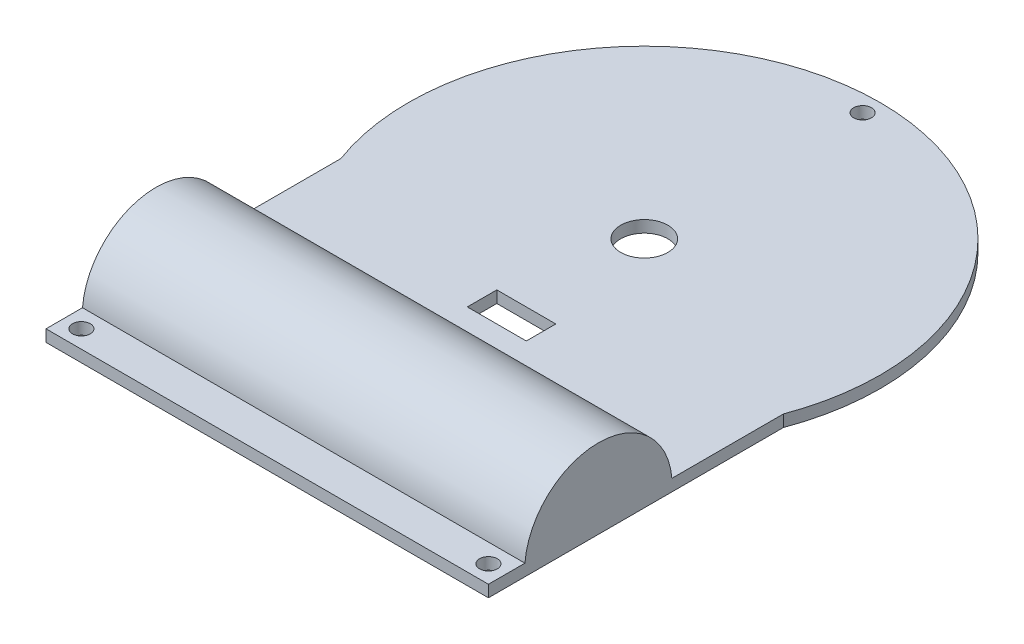
ISO-10303-21;
HEADER;
FILE_DESCRIPTION(('STEP AP214'),'2;1');
FILE_NAME('part.step','',(''),(''),'','','');
FILE_SCHEMA(('AUTOMOTIVE_DESIGN { 1 0 10303 214 1 1 1 1 }'));
ENDSEC;
DATA;
#1=APPLICATION_CONTEXT('core data for automotive mechanical design processes');
#2=APPLICATION_PROTOCOL_DEFINITION('international standard','automotive_design',2000,#1);
#3=PRODUCT_CONTEXT('',#1,'mechanical');
#4=PRODUCT('Part','Part','',(#3));
#5=PRODUCT_RELATED_PRODUCT_CATEGORY('part','',(#4));
#6=PRODUCT_DEFINITION_FORMATION('','',#4);
#7=PRODUCT_DEFINITION_CONTEXT('part definition',#1,'design');
#8=PRODUCT_DEFINITION('design','',#6,#7);
#9=PRODUCT_DEFINITION_SHAPE('','',#8);
#10=(LENGTH_UNIT() NAMED_UNIT(*) SI_UNIT(.MILLI.,.METRE.));
#11=(NAMED_UNIT(*) PLANE_ANGLE_UNIT() SI_UNIT($,.RADIAN.));
#12=(NAMED_UNIT(*) SI_UNIT($,.STERADIAN.) SOLID_ANGLE_UNIT());
#13=UNCERTAINTY_MEASURE_WITH_UNIT(LENGTH_MEASURE(1.E-05),#10,'distance_accuracy_value','');
#14=(GEOMETRIC_REPRESENTATION_CONTEXT(3) GLOBAL_UNCERTAINTY_ASSIGNED_CONTEXT((#13)) GLOBAL_UNIT_ASSIGNED_CONTEXT((#10,
#11,#12)) REPRESENTATION_CONTEXT('',''));
#15=CARTESIAN_POINT('',(0.,0.,0.));
#16=DIRECTION('',(0.,0.,1.));
#17=DIRECTION('',(1.,0.,0.));
#18=AXIS2_PLACEMENT_3D('',#15,#16,#17);
#19=CARTESIAN_POINT('',(40.,0.949918898305896,45.2788156846127));
#20=DIRECTION('',(-1.,0.,0.));
#21=DIRECTION('',(0.,0.,1.));
#22=AXIS2_PLACEMENT_3D('',#19,#20,#21);
#23=CYLINDRICAL_SURFACE('',#22,10.5);
#24=CARTESIAN_POINT('',(35.5,0.949918898305896,45.2788156846127));
#25=DIRECTION('',(1.,0.,0.));
#26=DIRECTION('',(0.,0.,-1.));
#27=AXIS2_PLACEMENT_3D('',#24,#25,#26);
#28=CIRCLE('',#27,10.5);
#29=CARTESIAN_POINT('',(35.5,0.,55.7357585498406));
#30=VERTEX_POINT('',#29);
#31=CARTESIAN_POINT('',(35.5,0.,34.8218728193848));
#32=VERTEX_POINT('',#31);
#33=EDGE_CURVE('E124',#30,#32,#28,.F.);
#34=ORIENTED_EDGE('',*,*,#33,.F.);
#35=DIRECTION('',(-1.,0.,0.));
#36=VECTOR('',#35,1.);
#37=CARTESIAN_POINT('',(65.8883835110597,0.,55.7357585498406));
#38=LINE('',#37,#36);
#39=CARTESIAN_POINT('',(-35.5,0.,55.7357585498406));
#40=VERTEX_POINT('',#39);
#41=EDGE_CURVE('E55',#30,#40,#38,.T.);
#42=ORIENTED_EDGE('',*,*,#41,.T.);
#43=CARTESIAN_POINT('',(-35.5,0.949918898305896,45.2788156846127));
#44=DIRECTION('',(-1.,0.,0.));
#45=DIRECTION('',(0.,0.,1.));
#46=AXIS2_PLACEMENT_3D('',#43,#44,#45);
#47=CIRCLE('',#46,10.5);
#48=CARTESIAN_POINT('',(-35.5,0.,34.8218728193848));
#49=VERTEX_POINT('',#48);
#50=EDGE_CURVE('E455',#49,#40,#47,.F.);
#51=ORIENTED_EDGE('',*,*,#50,.F.);
#52=DIRECTION('',(-1.,0.,0.));
#53=VECTOR('',#52,1.);
#54=CARTESIAN_POINT('',(40.,0.,34.8218728193848));
#55=LINE('',#54,#53);
#56=EDGE_CURVE('E48',#32,#49,#55,.T.);
#57=ORIENTED_EDGE('',*,*,#56,.F.);
#58=EDGE_LOOP('',(#34,#42,#51,#57));
#59=FACE_BOUND('',#58,.T.);
#60=ADVANCED_FACE('F34',(#59),#23,.F.);
#61=CARTESIAN_POINT('',(37.5,2.,63.9194109070751));
#62=DIRECTION('',(-1.,0.,0.));
#63=DIRECTION('',(0.,0.,1.));
#64=AXIS2_PLACEMENT_3D('',#61,#62,#63);
#65=PLANE('',#64);
#66=DIRECTION('',(0.,-1.,0.));
#67=VECTOR('',#66,1.);
#68=CARTESIAN_POINT('',(37.5,2.,63.9194109070751));
#69=LINE('',#68,#67);
#70=CARTESIAN_POINT('',(37.5,2.,63.9194109070751));
#71=VERTEX_POINT('',#70);
#72=CARTESIAN_POINT('',(37.5,0.,63.9194109070751));
#73=VERTEX_POINT('',#72);
#74=EDGE_CURVE('E225',#71,#73,#69,.T.);
#75=ORIENTED_EDGE('',*,*,#74,.T.);
#76=DIRECTION('',(0.,0.,-1.));
#77=VECTOR('',#76,1.);
#78=CARTESIAN_POINT('',(37.5,0.,63.9194109070751));
#79=LINE('',#78,#77);
#80=CARTESIAN_POINT('',(37.5,0.,13.9194109070751));
#81=VERTEX_POINT('',#80);
#82=EDGE_CURVE('E142',#73,#81,#79,.T.);
#83=ORIENTED_EDGE('',*,*,#82,.T.);
#84=DIRECTION('',(0.,-1.,0.));
#85=VECTOR('',#84,1.);
#86=CARTESIAN_POINT('',(37.5,2.,13.9194109070751));
#87=LINE('',#86,#85);
#88=CARTESIAN_POINT('',(37.5,2.,13.9194109070751));
#89=VERTEX_POINT('',#88);
#90=EDGE_CURVE('E161',#89,#81,#87,.T.);
#91=ORIENTED_EDGE('',*,*,#90,.F.);
#92=DIRECTION('',(0.,0.,-1.));
#93=VECTOR('',#92,1.);
#94=CARTESIAN_POINT('',(37.5,2.,63.9194109070751));
#95=LINE('',#94,#93);
#96=CARTESIAN_POINT('',(37.5,2.,32.8230005896514));
#97=VERTEX_POINT('',#96);
#98=EDGE_CURVE('E173',#97,#89,#95,.T.);
#99=ORIENTED_EDGE('',*,*,#98,.F.);
#100=CARTESIAN_POINT('',(37.5,0.949918898305896,45.2788156846127));
#101=DIRECTION('',(-1.,0.,0.));
#102=DIRECTION('',(0.,0.,1.));
#103=AXIS2_PLACEMENT_3D('',#100,#101,#102);
#104=CIRCLE('',#103,12.5);
#105=CARTESIAN_POINT('',(37.5,2.,57.734630779574));
#106=VERTEX_POINT('',#105);
#107=EDGE_CURVE('E131',#97,#106,#104,.F.);
#108=ORIENTED_EDGE('',*,*,#107,.T.);
#109=DIRECTION('',(0.,0.,-1.));
#110=VECTOR('',#109,1.);
#111=CARTESIAN_POINT('',(37.5,2.,63.9194109070751));
#112=LINE('',#111,#110);
#113=EDGE_CURVE('E227',#71,#106,#112,.T.);
#114=ORIENTED_EDGE('',*,*,#113,.F.);
#115=EDGE_LOOP('',(#75,#83,#91,#99,#108,#114));
#116=FACE_BOUND('',#115,.T.);
#117=ADVANCED_FACE('F257',(#116),#65,.F.);
#118=CARTESIAN_POINT('',(0.,2.,0.));
#119=DIRECTION('',(0.,1.,0.));
#120=DIRECTION('',(0.,0.,1.));
#121=AXIS2_PLACEMENT_3D('',#118,#119,#120);
#122=PLANE('',#121);
#123=DIRECTION('',(-1.,0.,0.));
#124=VECTOR('',#123,1.);
#125=CARTESIAN_POINT('',(65.8883835110597,2.,32.8230005896514));
#126=LINE('',#125,#124);
#127=CARTESIAN_POINT('',(-37.5,2.,32.8230005896514));
#128=VERTEX_POINT('',#127);
#129=EDGE_CURVE('E135',#97,#128,#126,.T.);
#130=ORIENTED_EDGE('',*,*,#129,.F.);
#131=ORIENTED_EDGE('',*,*,#98,.T.);
#132=CARTESIAN_POINT('',(0.,2.,0.));
#133=DIRECTION('',(0.,1.,0.));
#134=DIRECTION('',(0.,0.,1.));
#135=AXIS2_PLACEMENT_3D('',#132,#133,#134);
#136=CIRCLE('',#135,40.);
#137=CARTESIAN_POINT('',(-37.5,2.,13.919410907075));
#138=VERTEX_POINT('',#137);
#139=EDGE_CURVE('E170',#89,#138,#136,.T.);
#140=ORIENTED_EDGE('',*,*,#139,.T.);
#141=DIRECTION('',(0.,0.,1.));
#142=VECTOR('',#141,1.);
#143=CARTESIAN_POINT('',(-37.5,2.,63.9194109070751));
#144=LINE('',#143,#142);
#145=EDGE_CURVE('E172',#138,#128,#144,.T.);
#146=ORIENTED_EDGE('',*,*,#145,.T.);
#147=EDGE_LOOP('',(#130,#131,#140,#146));
#148=FACE_BOUND('',#147,.T.);
#149=CARTESIAN_POINT('',(0.,2.,0.));
#150=DIRECTION('',(0.,1.,0.));
#151=DIRECTION('',(0.,0.,1.));
#152=AXIS2_PLACEMENT_3D('',#149,#150,#151);
#153=CIRCLE('',#152,4.);
#154=CARTESIAN_POINT('',(0.,2.,4.));
#155=VERTEX_POINT('',#154);
#156=EDGE_CURVE('E164',#155,#155,#153,.T.);
#157=ORIENTED_EDGE('',*,*,#156,.F.);
#158=EDGE_LOOP('',(#157));
#159=FACE_BOUND('',#158,.T.);
#160=DIRECTION('',(0.,0.,1.));
#161=VECTOR('',#160,1.);
#162=CARTESIAN_POINT('',(-5.,2.,20.));
#163=LINE('',#162,#161);
#164=CARTESIAN_POINT('',(-5.,2.,20.));
#165=VERTEX_POINT('',#164);
#166=CARTESIAN_POINT('',(-5.,2.,25.));
#167=VERTEX_POINT('',#166);
#168=EDGE_CURVE('E189',#165,#167,#163,.T.);
#169=ORIENTED_EDGE('',*,*,#168,.F.);
#170=DIRECTION('',(-1.,0.,0.));
#171=VECTOR('',#170,1.);
#172=CARTESIAN_POINT('',(-5.,2.,20.));
#173=LINE('',#172,#171);
#174=CARTESIAN_POINT('',(5.,2.,20.));
#175=VERTEX_POINT('',#174);
#176=EDGE_CURVE('E186',#175,#165,#173,.T.);
#177=ORIENTED_EDGE('',*,*,#176,.F.);
#178=DIRECTION('',(0.,0.,-1.));
#179=VECTOR('',#178,1.);
#180=CARTESIAN_POINT('',(5.,2.,20.));
#181=LINE('',#180,#179);
#182=CARTESIAN_POINT('',(5.,2.,25.));
#183=VERTEX_POINT('',#182);
#184=EDGE_CURVE('E183',#183,#175,#181,.T.);
#185=ORIENTED_EDGE('',*,*,#184,.F.);
#186=DIRECTION('',(1.,0.,0.));
#187=VECTOR('',#186,1.);
#188=CARTESIAN_POINT('',(-5.,2.,25.));
#189=LINE('',#188,#187);
#190=EDGE_CURVE('E182',#167,#183,#189,.T.);
#191=ORIENTED_EDGE('',*,*,#190,.F.);
#192=EDGE_LOOP('',(#169,#177,#185,#191));
#193=FACE_BOUND('',#192,.T.);
#194=CARTESIAN_POINT('',(0.,2.,-37.));
#195=DIRECTION('',(0.,1.,0.));
#196=DIRECTION('',(0.,0.,1.));
#197=AXIS2_PLACEMENT_3D('',#194,#195,#196);
#198=CIRCLE('',#197,1.5);
#199=CARTESIAN_POINT('',(0.,2.,-35.5));
#200=VERTEX_POINT('',#199);
#201=EDGE_CURVE('E41',#200,#200,#198,.T.);
#202=ORIENTED_EDGE('',*,*,#201,.F.);
#203=EDGE_LOOP('',(#202));
#204=FACE_BOUND('',#203,.T.);
#205=ADVANCED_FACE('F261',(#148,#159,#193,#204),#122,.T.);
#206=CARTESIAN_POINT('',(0.,0.,0.));
#207=DIRECTION('',(0.,1.,0.));
#208=DIRECTION('',(0.,0.,1.));
#209=AXIS2_PLACEMENT_3D('',#206,#207,#208);
#210=PLANE('',#209);
#211=ORIENTED_EDGE('',*,*,#41,.F.);
#212=DIRECTION('',(0.,0.,-1.));
#213=VECTOR('',#212,1.);
#214=CARTESIAN_POINT('',(35.5,0.,57.7426695864619));
#215=LINE('',#214,#213);
#216=EDGE_CURVE('E122',#30,#32,#215,.T.);
#217=ORIENTED_EDGE('',*,*,#216,.T.);
#218=ORIENTED_EDGE('',*,*,#56,.T.);
#219=DIRECTION('',(0.,0.,1.));
#220=VECTOR('',#219,1.);
#221=CARTESIAN_POINT('',(-35.5,0.,32.8149617827635));
#222=LINE('',#221,#220);
#223=EDGE_CURVE('E126',#49,#40,#222,.T.);
#224=ORIENTED_EDGE('',*,*,#223,.T.);
#225=EDGE_LOOP('',(#211,#217,#218,#224));
#226=FACE_BOUND('',#225,.T.);
#227=ORIENTED_EDGE('',*,*,#82,.F.);
#228=DIRECTION('',(1.,0.,0.));
#229=VECTOR('',#228,1.);
#230=CARTESIAN_POINT('',(-37.5,0.,63.9194109070751));
#231=LINE('',#230,#229);
#232=CARTESIAN_POINT('',(-37.5,0.,63.9194109070751));
#233=VERTEX_POINT('',#232);
#234=EDGE_CURVE('E214',#233,#73,#231,.T.);
#235=ORIENTED_EDGE('',*,*,#234,.F.);
#236=DIRECTION('',(0.,0.,1.));
#237=VECTOR('',#236,1.);
#238=CARTESIAN_POINT('',(-37.5,0.,63.9194109070751));
#239=LINE('',#238,#237);
#240=CARTESIAN_POINT('',(-37.5,0.,13.919410907075));
#241=VERTEX_POINT('',#240);
#242=EDGE_CURVE('E144',#241,#233,#239,.T.);
#243=ORIENTED_EDGE('',*,*,#242,.F.);
#244=CARTESIAN_POINT('',(0.,0.,0.));
#245=DIRECTION('',(0.,1.,0.));
#246=DIRECTION('',(0.,0.,1.));
#247=AXIS2_PLACEMENT_3D('',#244,#245,#246);
#248=CIRCLE('',#247,40.);
#249=EDGE_CURVE('E165',#81,#241,#248,.T.);
#250=ORIENTED_EDGE('',*,*,#249,.F.);
#251=EDGE_LOOP('',(#227,#235,#243,#250));
#252=FACE_BOUND('',#251,.T.);
#253=CARTESIAN_POINT('',(0.,0.,0.));
#254=DIRECTION('',(0.,1.,0.));
#255=DIRECTION('',(0.,0.,1.));
#256=AXIS2_PLACEMENT_3D('',#253,#254,#255);
#257=CIRCLE('',#256,4.);
#258=CARTESIAN_POINT('',(0.,0.,4.));
#259=VERTEX_POINT('',#258);
#260=EDGE_CURVE('E156',#259,#259,#257,.T.);
#261=ORIENTED_EDGE('',*,*,#260,.T.);
#262=EDGE_LOOP('',(#261));
#263=FACE_BOUND('',#262,.T.);
#264=DIRECTION('',(-1.,0.,0.));
#265=VECTOR('',#264,1.);
#266=CARTESIAN_POINT('',(0.,0.,20.));
#267=LINE('',#266,#265);
#268=CARTESIAN_POINT('',(5.,0.,20.));
#269=VERTEX_POINT('',#268);
#270=CARTESIAN_POINT('',(-5.,0.,20.));
#271=VERTEX_POINT('',#270);
#272=EDGE_CURVE('E153',#269,#271,#267,.T.);
#273=ORIENTED_EDGE('',*,*,#272,.T.);
#274=DIRECTION('',(0.,0.,1.));
#275=VECTOR('',#274,1.);
#276=CARTESIAN_POINT('',(-5.,0.,0.));
#277=LINE('',#276,#275);
#278=CARTESIAN_POINT('',(-5.,0.,25.));
#279=VERTEX_POINT('',#278);
#280=EDGE_CURVE('E149',#271,#279,#277,.T.);
#281=ORIENTED_EDGE('',*,*,#280,.T.);
#282=DIRECTION('',(1.,0.,0.));
#283=VECTOR('',#282,1.);
#284=CARTESIAN_POINT('',(0.,0.,25.));
#285=LINE('',#284,#283);
#286=CARTESIAN_POINT('',(5.,0.,25.));
#287=VERTEX_POINT('',#286);
#288=EDGE_CURVE('E152',#279,#287,#285,.T.);
#289=ORIENTED_EDGE('',*,*,#288,.T.);
#290=DIRECTION('',(0.,0.,-1.));
#291=VECTOR('',#290,1.);
#292=CARTESIAN_POINT('',(5.,0.,0.));
#293=LINE('',#292,#291);
#294=EDGE_CURVE('E148',#287,#269,#293,.T.);
#295=ORIENTED_EDGE('',*,*,#294,.T.);
#296=EDGE_LOOP('',(#273,#281,#289,#295));
#297=FACE_BOUND('',#296,.T.);
#298=CARTESIAN_POINT('',(0.,0.,-37.));
#299=DIRECTION('',(0.,1.,0.));
#300=DIRECTION('',(0.,0.,1.));
#301=AXIS2_PLACEMENT_3D('',#298,#299,#300);
#302=CIRCLE('',#301,1.5);
#303=CARTESIAN_POINT('',(0.,0.,-35.5));
#304=VERTEX_POINT('',#303);
#305=EDGE_CURVE('E145',#304,#304,#302,.T.);
#306=ORIENTED_EDGE('',*,*,#305,.T.);
#307=EDGE_LOOP('',(#306));
#308=FACE_BOUND('',#307,.T.);
#309=CARTESIAN_POINT('',(-34.5,0.,60.9194109070751));
#310=DIRECTION('',(0.,1.,0.));
#311=DIRECTION('',(0.,0.,1.));
#312=AXIS2_PLACEMENT_3D('',#309,#310,#311);
#313=CIRCLE('',#312,1.5);
#314=CARTESIAN_POINT('',(-34.5,0.,62.4194109070751));
#315=VERTEX_POINT('',#314);
#316=EDGE_CURVE('E220',#315,#315,#313,.T.);
#317=ORIENTED_EDGE('',*,*,#316,.T.);
#318=EDGE_LOOP('',(#317));
#319=FACE_BOUND('',#318,.T.);
#320=CARTESIAN_POINT('',(34.5,0.,60.9194109070751));
#321=DIRECTION('',(0.,1.,0.));
#322=DIRECTION('',(0.,0.,1.));
#323=AXIS2_PLACEMENT_3D('',#320,#321,#322);
#324=CIRCLE('',#323,1.5);
#325=CARTESIAN_POINT('',(34.5,0.,62.4194109070751));
#326=VERTEX_POINT('',#325);
#327=EDGE_CURVE('E230',#326,#326,#324,.T.);
#328=ORIENTED_EDGE('',*,*,#327,.T.);
#329=EDGE_LOOP('',(#328));
#330=FACE_BOUND('',#329,.T.);
#331=ADVANCED_FACE('F128',(#226,#252,#263,#297,#308,#319,#330),#210,.F.);
#332=CARTESIAN_POINT('',(-37.5,2.,63.9194109070751));
#333=DIRECTION('',(1.,0.,0.));
#334=DIRECTION('',(0.,0.,-1.));
#335=AXIS2_PLACEMENT_3D('',#332,#333,#334);
#336=PLANE('',#335);
#337=ORIENTED_EDGE('',*,*,#242,.T.);
#338=DIRECTION('',(0.,-1.,0.));
#339=VECTOR('',#338,1.);
#340=CARTESIAN_POINT('',(-37.5,2.,63.9194109070751));
#341=LINE('',#340,#339);
#342=CARTESIAN_POINT('',(-37.5,2.,63.9194109070751));
#343=VERTEX_POINT('',#342);
#344=EDGE_CURVE('E138',#343,#233,#341,.T.);
#345=ORIENTED_EDGE('',*,*,#344,.F.);
#346=DIRECTION('',(0.,0.,1.));
#347=VECTOR('',#346,1.);
#348=CARTESIAN_POINT('',(-37.5,2.,63.9194109070751));
#349=LINE('',#348,#347);
#350=CARTESIAN_POINT('',(-37.5,2.,57.734630779574));
#351=VERTEX_POINT('',#350);
#352=EDGE_CURVE('E219',#351,#343,#349,.T.);
#353=ORIENTED_EDGE('',*,*,#352,.F.);
#354=CARTESIAN_POINT('',(-37.5,0.949918898305896,45.2788156846127));
#355=DIRECTION('',(-1.,0.,0.));
#356=DIRECTION('',(0.,0.,1.));
#357=AXIS2_PLACEMENT_3D('',#354,#355,#356);
#358=CIRCLE('',#357,12.5);
#359=EDGE_CURVE('E132',#351,#128,#358,.T.);
#360=ORIENTED_EDGE('',*,*,#359,.T.);
#361=ORIENTED_EDGE('',*,*,#145,.F.);
#362=DIRECTION('',(0.,-1.,0.));
#363=VECTOR('',#362,1.);
#364=CARTESIAN_POINT('',(-37.5,2.,13.919410907075));
#365=LINE('',#364,#363);
#366=EDGE_CURVE('E166',#138,#241,#365,.T.);
#367=ORIENTED_EDGE('',*,*,#366,.T.);
#368=EDGE_LOOP('',(#337,#345,#353,#360,#361,#367));
#369=FACE_BOUND('',#368,.T.);
#370=ADVANCED_FACE('F207',(#369),#336,.F.);
#371=CARTESIAN_POINT('',(0.,2.,0.));
#372=DIRECTION('',(0.,-1.,0.));
#373=DIRECTION('',(0.,0.,-1.));
#374=AXIS2_PLACEMENT_3D('',#371,#372,#373);
#375=CYLINDRICAL_SURFACE('',#374,40.);
#376=ORIENTED_EDGE('',*,*,#249,.T.);
#377=ORIENTED_EDGE('',*,*,#366,.F.);
#378=ORIENTED_EDGE('',*,*,#139,.F.);
#379=ORIENTED_EDGE('',*,*,#90,.T.);
#380=EDGE_LOOP('',(#376,#377,#378,#379));
#381=FACE_BOUND('',#380,.T.);
#382=ADVANCED_FACE('F271',(#381),#375,.T.);
#383=CARTESIAN_POINT('',(0.,0.,0.));
#384=DIRECTION('',(0.,1.,0.));
#385=DIRECTION('',(0.,0.,1.));
#386=AXIS2_PLACEMENT_3D('',#383,#384,#385);
#387=CYLINDRICAL_SURFACE('',#386,4.);
#388=ORIENTED_EDGE('',*,*,#260,.F.);
#389=EDGE_LOOP('',(#388));
#390=FACE_BOUND('',#389,.T.);
#391=ORIENTED_EDGE('',*,*,#156,.T.);
#392=EDGE_LOOP('',(#391));
#393=FACE_BOUND('',#392,.T.);
#394=ADVANCED_FACE('F276',(#390,#393),#387,.F.);
#395=CARTESIAN_POINT('',(-5.,-8.,20.));
#396=DIRECTION('',(-1.,0.,0.));
#397=DIRECTION('',(0.,0.,1.));
#398=AXIS2_PLACEMENT_3D('',#395,#396,#397);
#399=PLANE('',#398);
#400=DIRECTION('',(0.,1.,0.));
#401=VECTOR('',#400,1.);
#402=CARTESIAN_POINT('',(-5.,-8.,20.));
#403=LINE('',#402,#401);
#404=EDGE_CURVE('E176',#271,#165,#403,.T.);
#405=ORIENTED_EDGE('',*,*,#404,.T.);
#406=ORIENTED_EDGE('',*,*,#168,.T.);
#407=DIRECTION('',(0.,1.,0.));
#408=VECTOR('',#407,1.);
#409=CARTESIAN_POINT('',(-5.,-8.,25.));
#410=LINE('',#409,#408);
#411=EDGE_CURVE('E179',#279,#167,#410,.T.);
#412=ORIENTED_EDGE('',*,*,#411,.F.);
#413=ORIENTED_EDGE('',*,*,#280,.F.);
#414=EDGE_LOOP('',(#405,#406,#412,#413));
#415=FACE_BOUND('',#414,.T.);
#416=ADVANCED_FACE('F374',(#415),#399,.F.);
#417=CARTESIAN_POINT('',(-5.,-8.,20.));
#418=DIRECTION('',(0.,0.,-1.));
#419=DIRECTION('',(-1.,0.,0.));
#420=AXIS2_PLACEMENT_3D('',#417,#418,#419);
#421=PLANE('',#420);
#422=DIRECTION('',(0.,1.,0.));
#423=VECTOR('',#422,1.);
#424=CARTESIAN_POINT('',(5.,-8.,20.));
#425=LINE('',#424,#423);
#426=EDGE_CURVE('E187',#269,#175,#425,.T.);
#427=ORIENTED_EDGE('',*,*,#426,.T.);
#428=ORIENTED_EDGE('',*,*,#176,.T.);
#429=ORIENTED_EDGE('',*,*,#404,.F.);
#430=ORIENTED_EDGE('',*,*,#272,.F.);
#431=EDGE_LOOP('',(#427,#428,#429,#430));
#432=FACE_BOUND('',#431,.T.);
#433=ADVANCED_FACE('F364',(#432),#421,.F.);
#434=CARTESIAN_POINT('',(5.,-8.,20.));
#435=DIRECTION('',(1.,0.,0.));
#436=DIRECTION('',(0.,0.,-1.));
#437=AXIS2_PLACEMENT_3D('',#434,#435,#436);
#438=PLANE('',#437);
#439=DIRECTION('',(0.,1.,0.));
#440=VECTOR('',#439,1.);
#441=CARTESIAN_POINT('',(5.,-8.,25.));
#442=LINE('',#441,#440);
#443=EDGE_CURVE('E184',#287,#183,#442,.T.);
#444=ORIENTED_EDGE('',*,*,#443,.T.);
#445=ORIENTED_EDGE('',*,*,#184,.T.);
#446=ORIENTED_EDGE('',*,*,#426,.F.);
#447=ORIENTED_EDGE('',*,*,#294,.F.);
#448=EDGE_LOOP('',(#444,#445,#446,#447));
#449=FACE_BOUND('',#448,.T.);
#450=ADVANCED_FACE('F354',(#449),#438,.F.);
#451=CARTESIAN_POINT('',(-5.,-8.,25.));
#452=DIRECTION('',(0.,0.,1.));
#453=DIRECTION('',(1.,0.,0.));
#454=AXIS2_PLACEMENT_3D('',#451,#452,#453);
#455=PLANE('',#454);
#456=ORIENTED_EDGE('',*,*,#411,.T.);
#457=ORIENTED_EDGE('',*,*,#190,.T.);
#458=ORIENTED_EDGE('',*,*,#443,.F.);
#459=ORIENTED_EDGE('',*,*,#288,.F.);
#460=EDGE_LOOP('',(#456,#457,#458,#459));
#461=FACE_BOUND('',#460,.T.);
#462=ADVANCED_FACE('F344',(#461),#455,.F.);
#463=CARTESIAN_POINT('',(0.,-8.,-37.));
#464=DIRECTION('',(0.,1.,0.));
#465=DIRECTION('',(0.,0.,1.));
#466=AXIS2_PLACEMENT_3D('',#463,#464,#465);
#467=CYLINDRICAL_SURFACE('',#466,1.5);
#468=ORIENTED_EDGE('',*,*,#201,.T.);
#469=EDGE_LOOP('',(#468));
#470=FACE_BOUND('',#469,.T.);
#471=ORIENTED_EDGE('',*,*,#305,.F.);
#472=EDGE_LOOP('',(#471));
#473=FACE_BOUND('',#472,.T.);
#474=ADVANCED_FACE('F340',(#470,#473),#467,.F.);
#475=CARTESIAN_POINT('',(65.8883835110597,0.949918898305896,45.2788156846127));
#476=DIRECTION('',(-1.,0.,0.));
#477=DIRECTION('',(0.,0.,1.));
#478=AXIS2_PLACEMENT_3D('',#475,#476,#477);
#479=CYLINDRICAL_SURFACE('',#478,12.5);
#480=ORIENTED_EDGE('',*,*,#129,.T.);
#481=ORIENTED_EDGE('',*,*,#359,.F.);
#482=DIRECTION('',(-1.,0.,0.));
#483=VECTOR('',#482,1.);
#484=CARTESIAN_POINT('',(65.8883835110597,2.,57.734630779574));
#485=LINE('',#484,#483);
#486=EDGE_CURVE('E11',#106,#351,#485,.T.);
#487=ORIENTED_EDGE('',*,*,#486,.F.);
#488=ORIENTED_EDGE('',*,*,#107,.F.);
#489=EDGE_LOOP('',(#480,#481,#487,#488));
#490=FACE_BOUND('',#489,.T.);
#491=ADVANCED_FACE('F333',(#490),#479,.T.);
#492=CARTESIAN_POINT('',(-37.5,2.,63.9194109070751));
#493=DIRECTION('',(0.,0.,-1.));
#494=DIRECTION('',(-1.,0.,0.));
#495=AXIS2_PLACEMENT_3D('',#492,#493,#494);
#496=PLANE('',#495);
#497=ORIENTED_EDGE('',*,*,#234,.T.);
#498=ORIENTED_EDGE('',*,*,#74,.F.);
#499=DIRECTION('',(1.,0.,0.));
#500=VECTOR('',#499,1.);
#501=CARTESIAN_POINT('',(-37.5,2.,63.9194109070751));
#502=LINE('',#501,#500);
#503=EDGE_CURVE('E224',#343,#71,#502,.T.);
#504=ORIENTED_EDGE('',*,*,#503,.F.);
#505=ORIENTED_EDGE('',*,*,#344,.T.);
#506=EDGE_LOOP('',(#497,#498,#504,#505));
#507=FACE_BOUND('',#506,.T.);
#508=ADVANCED_FACE('F223',(#507),#496,.F.);
#509=CARTESIAN_POINT('',(34.5,-8.,60.9194109070751));
#510=DIRECTION('',(0.,1.,0.));
#511=DIRECTION('',(0.,0.,1.));
#512=AXIS2_PLACEMENT_3D('',#509,#510,#511);
#513=CYLINDRICAL_SURFACE('',#512,1.5);
#514=CARTESIAN_POINT('',(34.5,2.,60.9194109070751));
#515=DIRECTION('',(0.,1.,0.));
#516=DIRECTION('',(0.,0.,1.));
#517=AXIS2_PLACEMENT_3D('',#514,#515,#516);
#518=CIRCLE('',#517,1.5);
#519=CARTESIAN_POINT('',(34.5,2.,62.4194109070751));
#520=VERTEX_POINT('',#519);
#521=EDGE_CURVE('E452',#520,#520,#518,.T.);
#522=ORIENTED_EDGE('',*,*,#521,.T.);
#523=EDGE_LOOP('',(#522));
#524=FACE_BOUND('',#523,.T.);
#525=ORIENTED_EDGE('',*,*,#327,.F.);
#526=EDGE_LOOP('',(#525));
#527=FACE_BOUND('',#526,.T.);
#528=ADVANCED_FACE('F242',(#524,#527),#513,.F.);
#529=CARTESIAN_POINT('',(-34.5,-8.,60.9194109070751));
#530=DIRECTION('',(0.,1.,0.));
#531=DIRECTION('',(0.,0.,1.));
#532=AXIS2_PLACEMENT_3D('',#529,#530,#531);
#533=CYLINDRICAL_SURFACE('',#532,1.5);
#534=CARTESIAN_POINT('',(-34.5,2.,60.9194109070751));
#535=DIRECTION('',(0.,1.,0.));
#536=DIRECTION('',(0.,0.,1.));
#537=AXIS2_PLACEMENT_3D('',#534,#535,#536);
#538=CIRCLE('',#537,1.5);
#539=CARTESIAN_POINT('',(-34.5,2.,62.4194109070751));
#540=VERTEX_POINT('',#539);
#541=EDGE_CURVE('E233',#540,#540,#538,.T.);
#542=ORIENTED_EDGE('',*,*,#541,.T.);
#543=EDGE_LOOP('',(#542));
#544=FACE_BOUND('',#543,.T.);
#545=ORIENTED_EDGE('',*,*,#316,.F.);
#546=EDGE_LOOP('',(#545));
#547=FACE_BOUND('',#546,.T.);
#548=ADVANCED_FACE('F239',(#544,#547),#533,.F.);
#549=CARTESIAN_POINT('',(0.,2.,0.));
#550=DIRECTION('',(0.,1.,0.));
#551=DIRECTION('',(0.,0.,1.));
#552=AXIS2_PLACEMENT_3D('',#549,#550,#551);
#553=PLANE('',#552);
#554=ORIENTED_EDGE('',*,*,#113,.T.);
#555=ORIENTED_EDGE('',*,*,#486,.T.);
#556=ORIENTED_EDGE('',*,*,#352,.T.);
#557=ORIENTED_EDGE('',*,*,#503,.T.);
#558=EDGE_LOOP('',(#554,#555,#556,#557));
#559=FACE_BOUND('',#558,.T.);
#560=ORIENTED_EDGE('',*,*,#541,.F.);
#561=EDGE_LOOP('',(#560));
#562=FACE_BOUND('',#561,.T.);
#563=ORIENTED_EDGE('',*,*,#521,.F.);
#564=EDGE_LOOP('',(#563));
#565=FACE_BOUND('',#564,.T.);
#566=ADVANCED_FACE('F241',(#559,#562,#565),#553,.T.);
#567=CARTESIAN_POINT('',(-35.5,0.949918898305896,45.2788156846127));
#568=DIRECTION('',(-1.,0.,0.));
#569=DIRECTION('',(0.,0.,1.));
#570=AXIS2_PLACEMENT_3D('',#567,#568,#569);
#571=PLANE('',#570);
#572=ORIENTED_EDGE('',*,*,#223,.F.);
#573=ORIENTED_EDGE('',*,*,#50,.T.);
#574=EDGE_LOOP('',(#572,#573));
#575=FACE_BOUND('',#574,.T.);
#576=ADVANCED_FACE('F249',(#575),#571,.F.);
#577=CARTESIAN_POINT('',(35.5,0.949918898305896,45.2788156846127));
#578=DIRECTION('',(1.,0.,0.));
#579=DIRECTION('',(0.,0.,-1.));
#580=AXIS2_PLACEMENT_3D('',#577,#578,#579);
#581=PLANE('',#580);
#582=ORIENTED_EDGE('',*,*,#216,.F.);
#583=ORIENTED_EDGE('',*,*,#33,.T.);
#584=EDGE_LOOP('',(#582,#583));
#585=FACE_BOUND('',#584,.T.);
#586=ADVANCED_FACE('F123',(#585),#581,.F.);
#587=CLOSED_SHELL('',(#60,#117,#205,#331,#370,#382,#394,#416,#433,#450,#462,#474,#491,#508,#528,
#548,#566,#576,#586));
#588=MANIFOLD_SOLID_BREP('B2',#587);
#589=ADVANCED_BREP_SHAPE_REPRESENTATION('',(#18,#588),#14);
#590=SHAPE_DEFINITION_REPRESENTATION(#9,#589);
ENDSEC;
END-ISO-10303-21;
